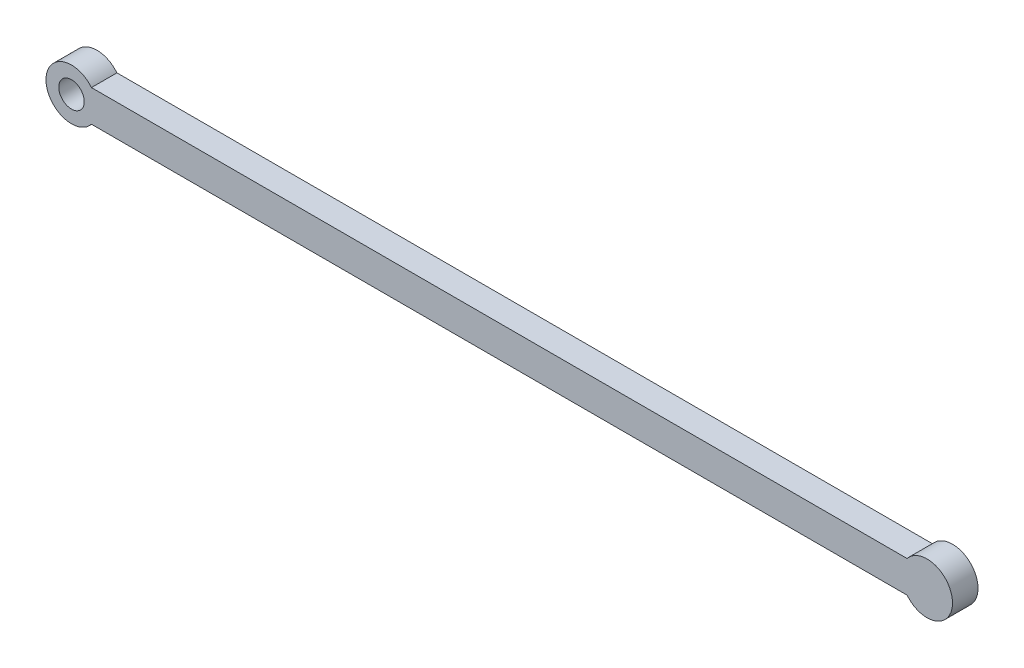
ISO-10303-21;
HEADER;
FILE_DESCRIPTION(('STEP AP214'),'2;1');
FILE_NAME('part.step','',(''),(''),'','','');
FILE_SCHEMA(('AUTOMOTIVE_DESIGN { 1 0 10303 214 1 1 1 1 }'));
ENDSEC;
DATA;
#1=APPLICATION_CONTEXT('core data for automotive mechanical design processes');
#2=APPLICATION_PROTOCOL_DEFINITION('international standard','automotive_design',2000,#1);
#3=PRODUCT_CONTEXT('',#1,'mechanical');
#4=PRODUCT('Part','Part','',(#3));
#5=PRODUCT_RELATED_PRODUCT_CATEGORY('part','',(#4));
#6=PRODUCT_DEFINITION_FORMATION('','',#4);
#7=PRODUCT_DEFINITION_CONTEXT('part definition',#1,'design');
#8=PRODUCT_DEFINITION('design','',#6,#7);
#9=PRODUCT_DEFINITION_SHAPE('','',#8);
#10=(LENGTH_UNIT() NAMED_UNIT(*) SI_UNIT(.MILLI.,.METRE.));
#11=(NAMED_UNIT(*) PLANE_ANGLE_UNIT() SI_UNIT($,.RADIAN.));
#12=(NAMED_UNIT(*) SI_UNIT($,.STERADIAN.) SOLID_ANGLE_UNIT());
#13=UNCERTAINTY_MEASURE_WITH_UNIT(LENGTH_MEASURE(1.E-05),#10,'distance_accuracy_value','');
#14=(GEOMETRIC_REPRESENTATION_CONTEXT(3) GLOBAL_UNCERTAINTY_ASSIGNED_CONTEXT((#13)) GLOBAL_UNIT_ASSIGNED_CONTEXT((#10,
#11,#12)) REPRESENTATION_CONTEXT('',''));
#15=CARTESIAN_POINT('',(0.,0.,0.));
#16=DIRECTION('',(0.,0.,1.));
#17=DIRECTION('',(1.,0.,0.));
#18=AXIS2_PLACEMENT_3D('',#15,#16,#17);
#19=CARTESIAN_POINT('',(0.,0.,5.));
#20=DIRECTION('',(0.,0.,1.));
#21=DIRECTION('',(1.,0.,0.));
#22=AXIS2_PLACEMENT_3D('',#19,#20,#21);
#23=PLANE('',#22);
#24=CARTESIAN_POINT('',(0.,0.,5.));
#25=DIRECTION('',(0.,0.,1.));
#26=DIRECTION('',(1.,0.,0.));
#27=AXIS2_PLACEMENT_3D('',#24,#25,#26);
#28=CIRCLE('',#27,4.99999999999999);
#29=CARTESIAN_POINT('',(3.91222270200245,3.11360137620993,5.));
#30=VERTEX_POINT('',#29);
#31=CARTESIAN_POINT('',(3.91222270200246,-3.11360137620996,5.));
#32=VERTEX_POINT('',#31);
#33=EDGE_CURVE('E93',#30,#32,#28,.T.);
#34=ORIENTED_EDGE('',*,*,#33,.T.);
#35=DIRECTION('',(1.,0.,0.));
#36=VECTOR('',#35,1.);
#37=CARTESIAN_POINT('',(3.91222270200246,-3.11360137620996,5.));
#38=LINE('',#37,#36);
#39=CARTESIAN_POINT('',(163.912222702002,-3.11360137620993,5.));
#40=VERTEX_POINT('',#39);
#41=EDGE_CURVE('E88',#32,#40,#38,.T.);
#42=ORIENTED_EDGE('',*,*,#41,.T.);
#43=CARTESIAN_POINT('',(167.824445404005,0.,5.));
#44=DIRECTION('',(0.,0.,1.));
#45=DIRECTION('',(-1.,0.,0.));
#46=AXIS2_PLACEMENT_3D('',#43,#44,#45);
#47=CIRCLE('',#46,4.99999999999998);
#48=CARTESIAN_POINT('',(163.912222702002,3.11360137620994,5.));
#49=VERTEX_POINT('',#48);
#50=EDGE_CURVE('E91',#40,#49,#47,.T.);
#51=ORIENTED_EDGE('',*,*,#50,.T.);
#52=DIRECTION('',(-1.,0.,0.));
#53=VECTOR('',#52,1.);
#54=CARTESIAN_POINT('',(3.91222270200245,3.11360137620993,5.));
#55=LINE('',#54,#53);
#56=EDGE_CURVE('E57',#49,#30,#55,.T.);
#57=ORIENTED_EDGE('',*,*,#56,.T.);
#58=EDGE_LOOP('',(#34,#42,#51,#57));
#59=FACE_BOUND('',#58,.T.);
#60=CARTESIAN_POINT('',(0.,0.,5.));
#61=DIRECTION('',(0.,0.,1.));
#62=DIRECTION('',(1.,0.,0.));
#63=AXIS2_PLACEMENT_3D('',#60,#61,#62);
#64=CIRCLE('',#63,2.5);
#65=CARTESIAN_POINT('',(2.5,0.,5.));
#66=VERTEX_POINT('',#65);
#67=EDGE_CURVE('E115',#66,#66,#64,.T.);
#68=ORIENTED_EDGE('',*,*,#67,.F.);
#69=EDGE_LOOP('',(#68));
#70=FACE_BOUND('',#69,.T.);
#71=ADVANCED_FACE('F39',(#59,#70),#23,.T.);
#72=CARTESIAN_POINT('',(0.,0.,0.));
#73=DIRECTION('',(0.,0.,1.));
#74=DIRECTION('',(1.,0.,0.));
#75=AXIS2_PLACEMENT_3D('',#72,#73,#74);
#76=PLANE('',#75);
#77=CARTESIAN_POINT('',(167.824445404005,0.,0.));
#78=DIRECTION('',(0.,0.,1.));
#79=DIRECTION('',(1.,0.,0.));
#80=AXIS2_PLACEMENT_3D('',#77,#78,#79);
#81=CIRCLE('',#80,0.0999999999999936);
#82=CARTESIAN_POINT('',(167.924445404005,0.,0.));
#83=VERTEX_POINT('',#82);
#84=EDGE_CURVE('E11',#83,#83,#81,.F.);
#85=ORIENTED_EDGE('',*,*,#84,.F.);
#86=EDGE_LOOP('',(#85));
#87=FACE_BOUND('',#86,.T.);
#88=CARTESIAN_POINT('',(0.,0.,0.));
#89=DIRECTION('',(0.,0.,1.));
#90=DIRECTION('',(1.,0.,0.));
#91=AXIS2_PLACEMENT_3D('',#88,#89,#90);
#92=CIRCLE('',#91,4.99999999999999);
#93=CARTESIAN_POINT('',(3.91222270200245,3.11360137620993,0.));
#94=VERTEX_POINT('',#93);
#95=CARTESIAN_POINT('',(3.91222270200246,-3.11360137620996,0.));
#96=VERTEX_POINT('',#95);
#97=EDGE_CURVE('E111',#94,#96,#92,.T.);
#98=ORIENTED_EDGE('',*,*,#97,.F.);
#99=DIRECTION('',(-1.,0.,0.));
#100=VECTOR('',#99,1.);
#101=CARTESIAN_POINT('',(3.91222270200245,3.11360137620993,0.));
#102=LINE('',#101,#100);
#103=CARTESIAN_POINT('',(163.912222702002,3.11360137620994,0.));
#104=VERTEX_POINT('',#103);
#105=EDGE_CURVE('E80',#104,#94,#102,.T.);
#106=ORIENTED_EDGE('',*,*,#105,.F.);
#107=CARTESIAN_POINT('',(167.824445404005,0.,0.));
#108=DIRECTION('',(0.,0.,1.));
#109=DIRECTION('',(-1.,0.,0.));
#110=AXIS2_PLACEMENT_3D('',#107,#108,#109);
#111=CIRCLE('',#110,4.99999999999998);
#112=CARTESIAN_POINT('',(163.912222702002,-3.11360137620993,0.));
#113=VERTEX_POINT('',#112);
#114=EDGE_CURVE('E74',#113,#104,#111,.T.);
#115=ORIENTED_EDGE('',*,*,#114,.F.);
#116=DIRECTION('',(1.,0.,0.));
#117=VECTOR('',#116,1.);
#118=CARTESIAN_POINT('',(3.91222270200246,-3.11360137620996,0.));
#119=LINE('',#118,#117);
#120=EDGE_CURVE('E99',#96,#113,#119,.T.);
#121=ORIENTED_EDGE('',*,*,#120,.F.);
#122=EDGE_LOOP('',(#98,#106,#115,#121));
#123=FACE_BOUND('',#122,.T.);
#124=CARTESIAN_POINT('',(0.,0.,0.));
#125=DIRECTION('',(0.,0.,1.));
#126=DIRECTION('',(1.,0.,0.));
#127=AXIS2_PLACEMENT_3D('',#124,#125,#126);
#128=CIRCLE('',#127,2.5);
#129=CARTESIAN_POINT('',(2.5,0.,0.));
#130=VERTEX_POINT('',#129);
#131=EDGE_CURVE('E136',#130,#130,#128,.T.);
#132=ORIENTED_EDGE('',*,*,#131,.T.);
#133=EDGE_LOOP('',(#132));
#134=FACE_BOUND('',#133,.T.);
#135=ADVANCED_FACE('F129',(#87,#123,#134),#76,.F.);
#136=CARTESIAN_POINT('',(0.,0.,5.));
#137=DIRECTION('',(0.,0.,-1.));
#138=DIRECTION('',(-1.,0.,0.));
#139=AXIS2_PLACEMENT_3D('',#136,#137,#138);
#140=CYLINDRICAL_SURFACE('',#139,4.99999999999999);
#141=ORIENTED_EDGE('',*,*,#97,.T.);
#142=DIRECTION('',(0.,0.,-1.));
#143=VECTOR('',#142,1.);
#144=CARTESIAN_POINT('',(3.91222270200246,-3.11360137620996,5.));
#145=LINE('',#144,#143);
#146=EDGE_CURVE('E49',#32,#96,#145,.T.);
#147=ORIENTED_EDGE('',*,*,#146,.F.);
#148=ORIENTED_EDGE('',*,*,#33,.F.);
#149=DIRECTION('',(0.,0.,-1.));
#150=VECTOR('',#149,1.);
#151=CARTESIAN_POINT('',(3.91222270200245,3.11360137620993,5.));
#152=LINE('',#151,#150);
#153=EDGE_CURVE('E107',#30,#94,#152,.T.);
#154=ORIENTED_EDGE('',*,*,#153,.T.);
#155=EDGE_LOOP('',(#141,#147,#148,#154));
#156=FACE_BOUND('',#155,.T.);
#157=ADVANCED_FACE('F41',(#156),#140,.T.);
#158=CARTESIAN_POINT('',(3.91222270200246,-3.11360137620996,5.));
#159=DIRECTION('',(0.,1.,0.));
#160=DIRECTION('',(-1.,0.,0.));
#161=AXIS2_PLACEMENT_3D('',#158,#159,#160);
#162=PLANE('',#161);
#163=ORIENTED_EDGE('',*,*,#120,.T.);
#164=DIRECTION('',(0.,0.,-1.));
#165=VECTOR('',#164,1.);
#166=CARTESIAN_POINT('',(163.912222702002,-3.11360137620993,5.));
#167=LINE('',#166,#165);
#168=EDGE_CURVE('E97',#40,#113,#167,.T.);
#169=ORIENTED_EDGE('',*,*,#168,.F.);
#170=ORIENTED_EDGE('',*,*,#41,.F.);
#171=ORIENTED_EDGE('',*,*,#146,.T.);
#172=EDGE_LOOP('',(#163,#169,#170,#171));
#173=FACE_BOUND('',#172,.T.);
#174=ADVANCED_FACE('F98',(#173),#162,.F.);
#175=CARTESIAN_POINT('',(167.824445404005,0.,5.));
#176=DIRECTION('',(0.,0.,-1.));
#177=DIRECTION('',(-1.,0.,0.));
#178=AXIS2_PLACEMENT_3D('',#175,#176,#177);
#179=CYLINDRICAL_SURFACE('',#178,4.99999999999998);
#180=ORIENTED_EDGE('',*,*,#114,.T.);
#181=DIRECTION('',(0.,0.,-1.));
#182=VECTOR('',#181,1.);
#183=CARTESIAN_POINT('',(163.912222702002,3.11360137620994,5.));
#184=LINE('',#183,#182);
#185=EDGE_CURVE('E101',#49,#104,#184,.T.);
#186=ORIENTED_EDGE('',*,*,#185,.F.);
#187=ORIENTED_EDGE('',*,*,#50,.F.);
#188=ORIENTED_EDGE('',*,*,#168,.T.);
#189=EDGE_LOOP('',(#180,#186,#187,#188));
#190=FACE_BOUND('',#189,.T.);
#191=ADVANCED_FACE('F103',(#190),#179,.T.);
#192=CARTESIAN_POINT('',(3.91222270200245,3.11360137620993,5.));
#193=DIRECTION('',(0.,-1.,0.));
#194=DIRECTION('',(1.,0.,0.));
#195=AXIS2_PLACEMENT_3D('',#192,#193,#194);
#196=PLANE('',#195);
#197=ORIENTED_EDGE('',*,*,#105,.T.);
#198=ORIENTED_EDGE('',*,*,#153,.F.);
#199=ORIENTED_EDGE('',*,*,#56,.F.);
#200=ORIENTED_EDGE('',*,*,#185,.T.);
#201=EDGE_LOOP('',(#197,#198,#199,#200));
#202=FACE_BOUND('',#201,.T.);
#203=ADVANCED_FACE('F163',(#202),#196,.F.);
#204=CARTESIAN_POINT('',(0.,0.,5.));
#205=DIRECTION('',(0.,0.,-1.));
#206=DIRECTION('',(-1.,0.,0.));
#207=AXIS2_PLACEMENT_3D('',#204,#205,#206);
#208=CYLINDRICAL_SURFACE('',#207,2.5);
#209=ORIENTED_EDGE('',*,*,#67,.T.);
#210=EDGE_LOOP('',(#209));
#211=FACE_BOUND('',#210,.T.);
#212=ORIENTED_EDGE('',*,*,#131,.F.);
#213=EDGE_LOOP('',(#212));
#214=FACE_BOUND('',#213,.T.);
#215=ADVANCED_FACE('F155',(#211,#214),#208,.F.);
#216=CARTESIAN_POINT('',(167.824445404005,0.,-0.1));
#217=DIRECTION('',(0.,0.,1.));
#218=DIRECTION('',(1.,0.,0.));
#219=AXIS2_PLACEMENT_3D('',#216,#217,#218);
#220=CYLINDRICAL_SURFACE('',#219,0.0999999999999936);
#221=CARTESIAN_POINT('',(167.824445404005,0.,-0.1));
#222=DIRECTION('',(0.,0.,-1.));
#223=DIRECTION('',(-1.,0.,0.));
#224=AXIS2_PLACEMENT_3D('',#221,#222,#223);
#225=CIRCLE('',#224,0.0999999999999936);
#226=CARTESIAN_POINT('',(167.724445404005,0.,-0.1));
#227=VERTEX_POINT('',#226);
#228=EDGE_CURVE('E139',#227,#227,#225,.T.);
#229=ORIENTED_EDGE('',*,*,#228,.F.);
#230=EDGE_LOOP('',(#229));
#231=FACE_BOUND('',#230,.T.);
#232=ORIENTED_EDGE('',*,*,#84,.T.);
#233=EDGE_LOOP('',(#232));
#234=FACE_BOUND('',#233,.T.);
#235=ADVANCED_FACE('F152',(#231,#234),#220,.T.);
#236=CARTESIAN_POINT('',(167.824445404005,0.,-0.1));
#237=DIRECTION('',(0.,0.,-1.));
#238=DIRECTION('',(-1.,0.,0.));
#239=AXIS2_PLACEMENT_3D('',#236,#237,#238);
#240=PLANE('',#239);
#241=ORIENTED_EDGE('',*,*,#228,.T.);
#242=EDGE_LOOP('',(#241));
#243=FACE_BOUND('',#242,.T.);
#244=ADVANCED_FACE('F150',(#243),#240,.T.);
#245=CLOSED_SHELL('',(#71,#135,#157,#174,#191,#203,#215,#235,#244));
#246=MANIFOLD_SOLID_BREP('B2',#245);
#247=ADVANCED_BREP_SHAPE_REPRESENTATION('',(#18,#246),#14);
#248=SHAPE_DEFINITION_REPRESENTATION(#9,#247);
ENDSEC;
END-ISO-10303-21;
